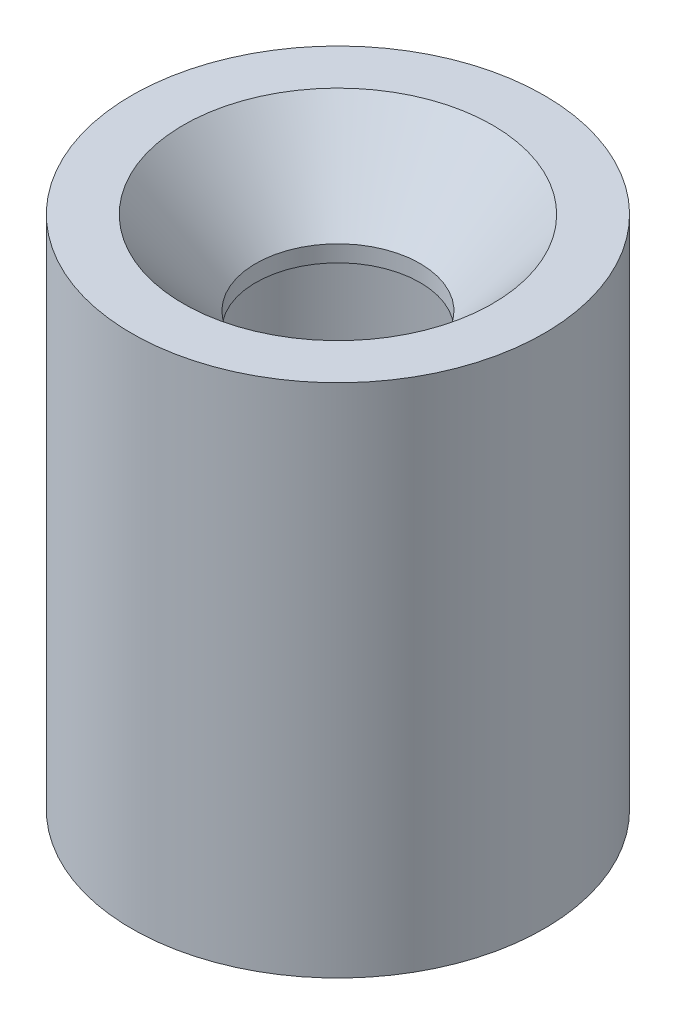
ISO-10303-21;
HEADER;
FILE_DESCRIPTION(('STEP AP214'),'2;1');
FILE_NAME('part.step','',(''),(''),'','','');
FILE_SCHEMA(('AUTOMOTIVE_DESIGN { 1 0 10303 214 1 1 1 1 }'));
ENDSEC;
DATA;
#1=APPLICATION_CONTEXT('core data for automotive mechanical design processes');
#2=APPLICATION_PROTOCOL_DEFINITION('international standard','automotive_design',2000,#1);
#3=PRODUCT_CONTEXT('',#1,'mechanical');
#4=PRODUCT('Part','Part','',(#3));
#5=PRODUCT_RELATED_PRODUCT_CATEGORY('part','',(#4));
#6=PRODUCT_DEFINITION_FORMATION('','',#4);
#7=PRODUCT_DEFINITION_CONTEXT('part definition',#1,'design');
#8=PRODUCT_DEFINITION('design','',#6,#7);
#9=PRODUCT_DEFINITION_SHAPE('','',#8);
#10=(LENGTH_UNIT() NAMED_UNIT(*) SI_UNIT(.MILLI.,.METRE.));
#11=(NAMED_UNIT(*) PLANE_ANGLE_UNIT() SI_UNIT($,.RADIAN.));
#12=(NAMED_UNIT(*) SI_UNIT($,.STERADIAN.) SOLID_ANGLE_UNIT());
#13=UNCERTAINTY_MEASURE_WITH_UNIT(LENGTH_MEASURE(1.E-05),#10,'distance_accuracy_value','');
#14=(GEOMETRIC_REPRESENTATION_CONTEXT(3) GLOBAL_UNCERTAINTY_ASSIGNED_CONTEXT((#13)) GLOBAL_UNIT_ASSIGNED_CONTEXT((#10,
#11,#12)) REPRESENTATION_CONTEXT('',''));
#15=CARTESIAN_POINT('',(0.,0.,0.));
#16=DIRECTION('',(0.,0.,1.));
#17=DIRECTION('',(1.,0.,0.));
#18=AXIS2_PLACEMENT_3D('',#15,#16,#17);
#19=CARTESIAN_POINT('',(4.9022,0.,0.));
#20=DIRECTION('',(0.,-1.,0.));
#21=DIRECTION('',(0.,0.,-1.));
#22=AXIS2_PLACEMENT_3D('',#19,#20,#21);
#23=PLANE('',#22);
#24=CARTESIAN_POINT('',(0.,0.,0.));
#25=DIRECTION('',(0.,-1.,0.));
#26=DIRECTION('',(0.,0.,-1.));
#27=AXIS2_PLACEMENT_3D('',#24,#25,#26);
#28=CIRCLE('',#27,6.35);
#29=CARTESIAN_POINT('',(0.,0.,-6.35));
#30=VERTEX_POINT('',#29);
#31=EDGE_CURVE('E10',#30,#30,#28,.T.);
#32=ORIENTED_EDGE('',*,*,#31,.T.);
#33=EDGE_LOOP('',(#32));
#34=FACE_BOUND('',#33,.T.);
#35=CARTESIAN_POINT('',(0.,0.,0.));
#36=DIRECTION('',(0.,-1.,0.));
#37=DIRECTION('',(0.,0.,-1.));
#38=AXIS2_PLACEMENT_3D('',#35,#36,#37);
#39=CIRCLE('',#38,4.9022);
#40=CARTESIAN_POINT('',(0.,0.,-4.9022));
#41=VERTEX_POINT('',#40);
#42=EDGE_CURVE('E56',#41,#41,#39,.T.);
#43=ORIENTED_EDGE('',*,*,#42,.F.);
#44=EDGE_LOOP('',(#43));
#45=FACE_BOUND('',#44,.T.);
#46=ADVANCED_FACE('F31',(#34,#45),#23,.T.);
#47=CARTESIAN_POINT('',(0.,0.,0.));
#48=DIRECTION('',(0.,-1.,0.));
#49=DIRECTION('',(0.,0.,-1.));
#50=AXIS2_PLACEMENT_3D('',#47,#48,#49);
#51=CYLINDRICAL_SURFACE('',#50,6.35);
#52=CARTESIAN_POINT('',(0.,15.875,0.));
#53=DIRECTION('',(0.,-1.,0.));
#54=DIRECTION('',(0.,0.,-1.));
#55=AXIS2_PLACEMENT_3D('',#52,#53,#54);
#56=CIRCLE('',#55,6.35);
#57=CARTESIAN_POINT('',(0.,15.875,-6.35));
#58=VERTEX_POINT('',#57);
#59=EDGE_CURVE('E37',#58,#58,#56,.T.);
#60=ORIENTED_EDGE('',*,*,#59,.T.);
#61=EDGE_LOOP('',(#60));
#62=FACE_BOUND('',#61,.T.);
#63=ORIENTED_EDGE('',*,*,#31,.F.);
#64=EDGE_LOOP('',(#63));
#65=FACE_BOUND('',#64,.T.);
#66=ADVANCED_FACE('F64',(#62,#65),#51,.T.);
#67=CARTESIAN_POINT('',(6.35,15.875,0.));
#68=DIRECTION('',(0.,1.,0.));
#69=DIRECTION('',(0.,0.,1.));
#70=AXIS2_PLACEMENT_3D('',#67,#68,#69);
#71=PLANE('',#70);
#72=CARTESIAN_POINT('',(0.,15.875,0.));
#73=DIRECTION('',(0.,-1.,0.));
#74=DIRECTION('',(0.,0.,-1.));
#75=AXIS2_PLACEMENT_3D('',#72,#73,#74);
#76=CIRCLE('',#75,4.7625);
#77=CARTESIAN_POINT('',(0.,15.875,-4.7625));
#78=VERTEX_POINT('',#77);
#79=EDGE_CURVE('E41',#78,#78,#76,.T.);
#80=ORIENTED_EDGE('',*,*,#79,.T.);
#81=EDGE_LOOP('',(#80));
#82=FACE_BOUND('',#81,.T.);
#83=ORIENTED_EDGE('',*,*,#59,.F.);
#84=EDGE_LOOP('',(#83));
#85=FACE_BOUND('',#84,.T.);
#86=ADVANCED_FACE('F68',(#82,#85),#71,.T.);
#87=CARTESIAN_POINT('',(0.,15.875,0.));
#88=DIRECTION('',(0.,1.,0.));
#89=DIRECTION('',(0.,0.,1.));
#90=AXIS2_PLACEMENT_3D('',#87,#88,#89);
#91=CONICAL_SURFACE('',#90,4.7625,0.71558499331767);
#92=CARTESIAN_POINT('',(0.,13.3036965361796,0.));
#93=DIRECTION('',(0.,-1.,0.));
#94=DIRECTION('',(0.,0.,-1.));
#95=AXIS2_PLACEMENT_3D('',#92,#93,#94);
#96=CIRCLE('',#95,2.5273);
#97=CARTESIAN_POINT('',(0.,13.3036965361796,-2.5273));
#98=VERTEX_POINT('',#97);
#99=EDGE_CURVE('E45',#98,#98,#96,.T.);
#100=ORIENTED_EDGE('',*,*,#99,.T.);
#101=EDGE_LOOP('',(#100));
#102=FACE_BOUND('',#101,.T.);
#103=ORIENTED_EDGE('',*,*,#79,.F.);
#104=EDGE_LOOP('',(#103));
#105=FACE_BOUND('',#104,.T.);
#106=ADVANCED_FACE('F72',(#102,#105),#91,.F.);
#107=CARTESIAN_POINT('',(0.,0.,0.));
#108=DIRECTION('',(0.,-1.,0.));
#109=DIRECTION('',(0.,0.,-1.));
#110=AXIS2_PLACEMENT_3D('',#107,#108,#109);
#111=CYLINDRICAL_SURFACE('',#110,2.5273);
#112=CARTESIAN_POINT('',(0.,12.7956965361796,0.));
#113=DIRECTION('',(0.,-1.,0.));
#114=DIRECTION('',(0.,0.,-1.));
#115=AXIS2_PLACEMENT_3D('',#112,#113,#114);
#116=CIRCLE('',#115,2.5273);
#117=CARTESIAN_POINT('',(0.,12.7956965361796,-2.5273));
#118=VERTEX_POINT('',#117);
#119=EDGE_CURVE('E50',#118,#118,#116,.T.);
#120=ORIENTED_EDGE('',*,*,#119,.T.);
#121=EDGE_LOOP('',(#120));
#122=FACE_BOUND('',#121,.T.);
#123=ORIENTED_EDGE('',*,*,#99,.F.);
#124=EDGE_LOOP('',(#123));
#125=FACE_BOUND('',#124,.T.);
#126=ADVANCED_FACE('F79',(#122,#125),#111,.F.);
#127=CARTESIAN_POINT('',(2.5273,12.7956965361796,0.));
#128=DIRECTION('',(0.,-1.,0.));
#129=DIRECTION('',(0.,0.,-1.));
#130=AXIS2_PLACEMENT_3D('',#127,#128,#129);
#131=PLANE('',#130);
#132=CARTESIAN_POINT('',(0.,12.7956965361796,0.));
#133=DIRECTION('',(0.,-1.,0.));
#134=DIRECTION('',(0.,0.,-1.));
#135=AXIS2_PLACEMENT_3D('',#132,#133,#134);
#136=CIRCLE('',#135,4.9022);
#137=CARTESIAN_POINT('',(0.,12.7956965361796,-4.9022));
#138=VERTEX_POINT('',#137);
#139=EDGE_CURVE('E53',#138,#138,#136,.T.);
#140=ORIENTED_EDGE('',*,*,#139,.T.);
#141=EDGE_LOOP('',(#140));
#142=FACE_BOUND('',#141,.T.);
#143=ORIENTED_EDGE('',*,*,#119,.F.);
#144=EDGE_LOOP('',(#143));
#145=FACE_BOUND('',#144,.T.);
#146=ADVANCED_FACE('F83',(#142,#145),#131,.T.);
#147=CARTESIAN_POINT('',(0.,0.,0.));
#148=DIRECTION('',(0.,-1.,0.));
#149=DIRECTION('',(0.,0.,-1.));
#150=AXIS2_PLACEMENT_3D('',#147,#148,#149);
#151=CYLINDRICAL_SURFACE('',#150,4.9022);
#152=ORIENTED_EDGE('',*,*,#42,.T.);
#153=EDGE_LOOP('',(#152));
#154=FACE_BOUND('',#153,.T.);
#155=ORIENTED_EDGE('',*,*,#139,.F.);
#156=EDGE_LOOP('',(#155));
#157=FACE_BOUND('',#156,.T.);
#158=ADVANCED_FACE('F60',(#154,#157),#151,.F.);
#159=CLOSED_SHELL('',(#46,#66,#86,#106,#126,#146,#158));
#160=MANIFOLD_SOLID_BREP('B2',#159);
#161=ADVANCED_BREP_SHAPE_REPRESENTATION('',(#18,#160),#14);
#162=SHAPE_DEFINITION_REPRESENTATION(#9,#161);
ENDSEC;
END-ISO-10303-21;
